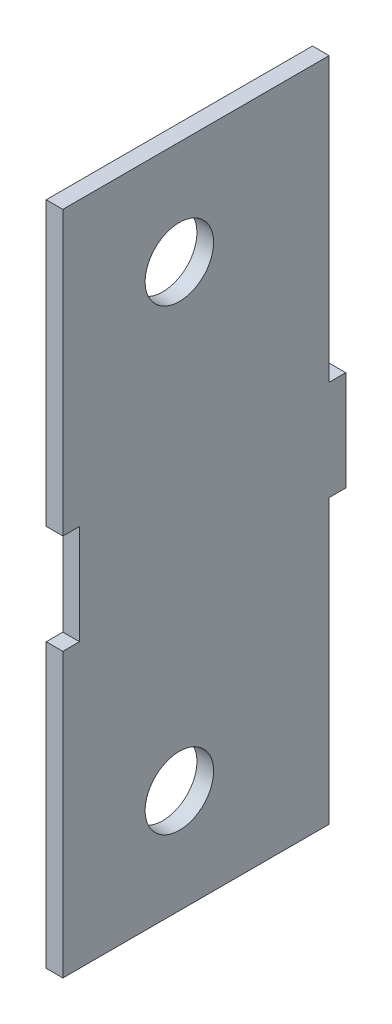
ISO-10303-21;
HEADER;
FILE_DESCRIPTION(('STEP AP214'),'2;1');
FILE_NAME('part.step','',(''),(''),'','','');
FILE_SCHEMA(('AUTOMOTIVE_DESIGN { 1 0 10303 214 1 1 1 1 }'));
ENDSEC;
DATA;
#1=APPLICATION_CONTEXT('core data for automotive mechanical design processes');
#2=APPLICATION_PROTOCOL_DEFINITION('international standard','automotive_design',2000,#1);
#3=PRODUCT_CONTEXT('',#1,'mechanical');
#4=PRODUCT('Part','Part','',(#3));
#5=PRODUCT_RELATED_PRODUCT_CATEGORY('part','',(#4));
#6=PRODUCT_DEFINITION_FORMATION('','',#4);
#7=PRODUCT_DEFINITION_CONTEXT('part definition',#1,'design');
#8=PRODUCT_DEFINITION('design','',#6,#7);
#9=PRODUCT_DEFINITION_SHAPE('','',#8);
#10=(LENGTH_UNIT() NAMED_UNIT(*) SI_UNIT(.MILLI.,.METRE.));
#11=(NAMED_UNIT(*) PLANE_ANGLE_UNIT() SI_UNIT($,.RADIAN.));
#12=(NAMED_UNIT(*) SI_UNIT($,.STERADIAN.) SOLID_ANGLE_UNIT());
#13=UNCERTAINTY_MEASURE_WITH_UNIT(LENGTH_MEASURE(1.E-05),#10,'distance_accuracy_value','');
#14=(GEOMETRIC_REPRESENTATION_CONTEXT(3) GLOBAL_UNCERTAINTY_ASSIGNED_CONTEXT((#13)) GLOBAL_UNIT_ASSIGNED_CONTEXT((#10,
#11,#12)) REPRESENTATION_CONTEXT('',''));
#15=CARTESIAN_POINT('',(0.,0.,0.));
#16=DIRECTION('',(0.,0.,1.));
#17=DIRECTION('',(1.,0.,0.));
#18=AXIS2_PLACEMENT_3D('',#15,#16,#17);
#19=CARTESIAN_POINT('',(1.5875,0.,0.));
#20=DIRECTION('',(-1.,0.,0.));
#21=DIRECTION('',(0.,0.,1.));
#22=AXIS2_PLACEMENT_3D('',#19,#20,#21);
#23=PLANE('',#22);
#24=CARTESIAN_POINT('',(1.5875,-21.844,1.58750000000008));
#25=DIRECTION('',(1.,0.,0.));
#26=DIRECTION('',(0.,0.,-1.));
#27=AXIS2_PLACEMENT_3D('',#24,#25,#26);
#28=CIRCLE('',#27,3.2639);
#29=CARTESIAN_POINT('',(1.5875,-21.844,-1.67639999999992));
#30=VERTEX_POINT('',#29);
#31=EDGE_CURVE('E181',#30,#30,#28,.T.);
#32=ORIENTED_EDGE('',*,*,#31,.F.);
#33=EDGE_LOOP('',(#32));
#34=FACE_BOUND('',#33,.T.);
#35=CARTESIAN_POINT('',(1.5875,21.844,1.58749999999993));
#36=DIRECTION('',(1.,0.,0.));
#37=DIRECTION('',(0.,0.,-1.));
#38=AXIS2_PLACEMENT_3D('',#35,#36,#37);
#39=CIRCLE('',#38,3.2639);
#40=CARTESIAN_POINT('',(1.5875,21.844,-1.67640000000007));
#41=VERTEX_POINT('',#40);
#42=EDGE_CURVE('E187',#41,#41,#39,.T.);
#43=ORIENTED_EDGE('',*,*,#42,.F.);
#44=EDGE_LOOP('',(#43));
#45=FACE_BOUND('',#44,.T.);
#46=DIRECTION('',(0.,0.,-1.));
#47=VECTOR('',#46,1.);
#48=CARTESIAN_POINT('',(1.5875,4.7625,12.7));
#49=LINE('',#48,#47);
#50=CARTESIAN_POINT('',(1.5875,4.7625,12.7));
#51=VERTEX_POINT('',#50);
#52=CARTESIAN_POINT('',(1.5875,4.7625,11.1125));
#53=VERTEX_POINT('',#52);
#54=EDGE_CURVE('E134',#51,#53,#49,.T.);
#55=ORIENTED_EDGE('',*,*,#54,.T.);
#56=DIRECTION('',(0.,-1.,0.));
#57=VECTOR('',#56,1.);
#58=CARTESIAN_POINT('',(1.5875,4.7625,11.1125));
#59=LINE('',#58,#57);
#60=CARTESIAN_POINT('',(1.5875,-4.7625,11.1125));
#61=VERTEX_POINT('',#60);
#62=EDGE_CURVE('E142',#53,#61,#59,.T.);
#63=ORIENTED_EDGE('',*,*,#62,.T.);
#64=DIRECTION('',(0.,0.,-1.));
#65=VECTOR('',#64,1.);
#66=CARTESIAN_POINT('',(1.5875,-4.7625,12.7));
#67=LINE('',#66,#65);
#68=CARTESIAN_POINT('',(1.5875,-4.7625,12.7));
#69=VERTEX_POINT('',#68);
#70=EDGE_CURVE('E147',#69,#61,#67,.T.);
#71=ORIENTED_EDGE('',*,*,#70,.F.);
#72=DIRECTION('',(0.,-1.,0.));
#73=VECTOR('',#72,1.);
#74=CARTESIAN_POINT('',(1.5875,-31.75,12.7));
#75=LINE('',#74,#73);
#76=CARTESIAN_POINT('',(1.5875,-31.75,12.7));
#77=VERTEX_POINT('',#76);
#78=EDGE_CURVE('E199',#69,#77,#75,.T.);
#79=ORIENTED_EDGE('',*,*,#78,.T.);
#80=DIRECTION('',(0.,0.,-1.));
#81=VECTOR('',#80,1.);
#82=CARTESIAN_POINT('',(1.5875,-31.75,12.7));
#83=LINE('',#82,#81);
#84=CARTESIAN_POINT('',(1.5875,-31.75,-12.7));
#85=VERTEX_POINT('',#84);
#86=EDGE_CURVE('E201',#77,#85,#83,.T.);
#87=ORIENTED_EDGE('',*,*,#86,.T.);
#88=DIRECTION('',(0.,1.,0.));
#89=VECTOR('',#88,1.);
#90=CARTESIAN_POINT('',(1.5875,-31.75,-12.7));
#91=LINE('',#90,#89);
#92=CARTESIAN_POINT('',(1.5875,-4.7625,-12.7));
#93=VERTEX_POINT('',#92);
#94=EDGE_CURVE('E193',#85,#93,#91,.T.);
#95=ORIENTED_EDGE('',*,*,#94,.T.);
#96=DIRECTION('',(0.,0.,-1.));
#97=VECTOR('',#96,1.);
#98=CARTESIAN_POINT('',(1.5875,-4.7625,-12.7));
#99=LINE('',#98,#97);
#100=CARTESIAN_POINT('',(1.5875,-4.7625,-14.2875));
#101=VERTEX_POINT('',#100);
#102=EDGE_CURVE('E64',#93,#101,#99,.T.);
#103=ORIENTED_EDGE('',*,*,#102,.T.);
#104=DIRECTION('',(0.,-1.,0.));
#105=VECTOR('',#104,1.);
#106=CARTESIAN_POINT('',(1.5875,4.7625,-14.2875));
#107=LINE('',#106,#105);
#108=CARTESIAN_POINT('',(1.5875,4.7625,-14.2875));
#109=VERTEX_POINT('',#108);
#110=EDGE_CURVE('E168',#109,#101,#107,.T.);
#111=ORIENTED_EDGE('',*,*,#110,.F.);
#112=DIRECTION('',(0.,0.,-1.));
#113=VECTOR('',#112,1.);
#114=CARTESIAN_POINT('',(1.5875,4.7625,-12.7));
#115=LINE('',#114,#113);
#116=CARTESIAN_POINT('',(1.5875,4.7625,-12.7));
#117=VERTEX_POINT('',#116);
#118=EDGE_CURVE('E162',#117,#109,#115,.T.);
#119=ORIENTED_EDGE('',*,*,#118,.F.);
#120=CARTESIAN_POINT('',(1.5875,31.75,-12.7));
#121=VERTEX_POINT('',#120);
#122=EDGE_CURVE('E197',#117,#121,#91,.T.);
#123=ORIENTED_EDGE('',*,*,#122,.T.);
#124=DIRECTION('',(0.,0.,1.));
#125=VECTOR('',#124,1.);
#126=CARTESIAN_POINT('',(1.5875,31.75,12.7));
#127=LINE('',#126,#125);
#128=CARTESIAN_POINT('',(1.5875,31.75,12.7));
#129=VERTEX_POINT('',#128);
#130=EDGE_CURVE('E196',#121,#129,#127,.T.);
#131=ORIENTED_EDGE('',*,*,#130,.T.);
#132=EDGE_CURVE('E151',#129,#51,#75,.T.);
#133=ORIENTED_EDGE('',*,*,#132,.T.);
#134=EDGE_LOOP('',(#55,#63,#71,#79,#87,#95,#103,#111,#119,#123,#131,#133));
#135=FACE_BOUND('',#134,.T.);
#136=ADVANCED_FACE('F41',(#34,#45,#135),#23,.F.);
#137=CARTESIAN_POINT('',(0.,0.,0.));
#138=DIRECTION('',(-1.,0.,0.));
#139=DIRECTION('',(0.,0.,1.));
#140=AXIS2_PLACEMENT_3D('',#137,#138,#139);
#141=PLANE('',#140);
#142=CARTESIAN_POINT('',(0.,21.844,1.58749999999993));
#143=DIRECTION('',(1.,0.,0.));
#144=DIRECTION('',(0.,0.,-1.));
#145=AXIS2_PLACEMENT_3D('',#142,#143,#144);
#146=CIRCLE('',#145,3.2639);
#147=CARTESIAN_POINT('',(0.,21.844,-1.67640000000007));
#148=VERTEX_POINT('',#147);
#149=EDGE_CURVE('E184',#148,#148,#146,.T.);
#150=ORIENTED_EDGE('',*,*,#149,.T.);
#151=EDGE_LOOP('',(#150));
#152=FACE_BOUND('',#151,.T.);
#153=CARTESIAN_POINT('',(0.,-21.844,1.58750000000008));
#154=DIRECTION('',(1.,0.,0.));
#155=DIRECTION('',(0.,0.,-1.));
#156=AXIS2_PLACEMENT_3D('',#153,#154,#155);
#157=CIRCLE('',#156,3.2639);
#158=CARTESIAN_POINT('',(0.,-21.844,-1.67639999999992));
#159=VERTEX_POINT('',#158);
#160=EDGE_CURVE('E174',#159,#159,#157,.T.);
#161=ORIENTED_EDGE('',*,*,#160,.T.);
#162=EDGE_LOOP('',(#161));
#163=FACE_BOUND('',#162,.T.);
#164=DIRECTION('',(0.,1.,0.));
#165=VECTOR('',#164,1.);
#166=CARTESIAN_POINT('',(0.,0.,11.1125));
#167=LINE('',#166,#165);
#168=CARTESIAN_POINT('',(0.,-4.7625,11.1125));
#169=VERTEX_POINT('',#168);
#170=CARTESIAN_POINT('',(0.,4.7625,11.1125));
#171=VERTEX_POINT('',#170);
#172=EDGE_CURVE('E11',#169,#171,#167,.T.);
#173=ORIENTED_EDGE('',*,*,#172,.T.);
#174=DIRECTION('',(0.,0.,1.));
#175=VECTOR('',#174,1.);
#176=CARTESIAN_POINT('',(0.,4.7625,0.));
#177=LINE('',#176,#175);
#178=CARTESIAN_POINT('',(0.,4.7625,12.7));
#179=VERTEX_POINT('',#178);
#180=EDGE_CURVE('E137',#171,#179,#177,.T.);
#181=ORIENTED_EDGE('',*,*,#180,.T.);
#182=DIRECTION('',(0.,-1.,0.));
#183=VECTOR('',#182,1.);
#184=CARTESIAN_POINT('',(0.,-31.75,12.7));
#185=LINE('',#184,#183);
#186=CARTESIAN_POINT('',(0.,31.75,12.7));
#187=VERTEX_POINT('',#186);
#188=EDGE_CURVE('E210',#187,#179,#185,.T.);
#189=ORIENTED_EDGE('',*,*,#188,.F.);
#190=DIRECTION('',(0.,0.,1.));
#191=VECTOR('',#190,1.);
#192=CARTESIAN_POINT('',(0.,31.75,12.7));
#193=LINE('',#192,#191);
#194=CARTESIAN_POINT('',(0.,31.75,-12.7));
#195=VERTEX_POINT('',#194);
#196=EDGE_CURVE('E207',#195,#187,#193,.T.);
#197=ORIENTED_EDGE('',*,*,#196,.F.);
#198=DIRECTION('',(0.,1.,0.));
#199=VECTOR('',#198,1.);
#200=CARTESIAN_POINT('',(0.,-31.75,-12.7));
#201=LINE('',#200,#199);
#202=CARTESIAN_POINT('',(0.,4.7625,-12.7));
#203=VERTEX_POINT('',#202);
#204=EDGE_CURVE('E190',#203,#195,#201,.T.);
#205=ORIENTED_EDGE('',*,*,#204,.F.);
#206=DIRECTION('',(0.,0.,-1.));
#207=VECTOR('',#206,1.);
#208=CARTESIAN_POINT('',(0.,4.7625,-12.7));
#209=LINE('',#208,#207);
#210=CARTESIAN_POINT('',(0.,4.7625,-14.2875));
#211=VERTEX_POINT('',#210);
#212=EDGE_CURVE('E164',#203,#211,#209,.T.);
#213=ORIENTED_EDGE('',*,*,#212,.T.);
#214=DIRECTION('',(0.,-1.,0.));
#215=VECTOR('',#214,1.);
#216=CARTESIAN_POINT('',(0.,4.7625,-14.2875));
#217=LINE('',#216,#215);
#218=CARTESIAN_POINT('',(0.,-4.7625,-14.2875));
#219=VERTEX_POINT('',#218);
#220=EDGE_CURVE('E161',#211,#219,#217,.T.);
#221=ORIENTED_EDGE('',*,*,#220,.T.);
#222=DIRECTION('',(0.,0.,-1.));
#223=VECTOR('',#222,1.);
#224=CARTESIAN_POINT('',(0.,-4.7625,-12.7));
#225=LINE('',#224,#223);
#226=CARTESIAN_POINT('',(0.,-4.7625,-12.7));
#227=VERTEX_POINT('',#226);
#228=EDGE_CURVE('E158',#227,#219,#225,.T.);
#229=ORIENTED_EDGE('',*,*,#228,.F.);
#230=CARTESIAN_POINT('',(0.,-31.75,-12.7));
#231=VERTEX_POINT('',#230);
#232=EDGE_CURVE('E204',#231,#227,#201,.T.);
#233=ORIENTED_EDGE('',*,*,#232,.F.);
#234=DIRECTION('',(0.,0.,-1.));
#235=VECTOR('',#234,1.);
#236=CARTESIAN_POINT('',(0.,-31.75,12.7));
#237=LINE('',#236,#235);
#238=CARTESIAN_POINT('',(0.,-31.75,12.7));
#239=VERTEX_POINT('',#238);
#240=EDGE_CURVE('E213',#239,#231,#237,.T.);
#241=ORIENTED_EDGE('',*,*,#240,.F.);
#242=CARTESIAN_POINT('',(0.,-4.7625,12.7));
#243=VERTEX_POINT('',#242);
#244=EDGE_CURVE('E209',#243,#239,#185,.T.);
#245=ORIENTED_EDGE('',*,*,#244,.F.);
#246=DIRECTION('',(0.,0.,1.));
#247=VECTOR('',#246,1.);
#248=CARTESIAN_POINT('',(0.,-4.76249999999999,0.));
#249=LINE('',#248,#247);
#250=EDGE_CURVE('E56',#169,#243,#249,.T.);
#251=ORIENTED_EDGE('',*,*,#250,.F.);
#252=EDGE_LOOP('',(#173,#181,#189,#197,#205,#213,#221,#229,#233,#241,#245,#251));
#253=FACE_BOUND('',#252,.T.);
#254=ADVANCED_FACE('F230',(#152,#163,#253),#141,.T.);
#255=CARTESIAN_POINT('',(1.5875,-31.75,12.7));
#256=DIRECTION('',(0.,0.,-1.));
#257=DIRECTION('',(-1.,0.,0.));
#258=AXIS2_PLACEMENT_3D('',#255,#256,#257);
#259=PLANE('',#258);
#260=DIRECTION('',(-1.,0.,0.));
#261=VECTOR('',#260,1.);
#262=CARTESIAN_POINT('',(1.5875,4.7625,12.7));
#263=LINE('',#262,#261);
#264=EDGE_CURVE('E49',#51,#179,#263,.T.);
#265=ORIENTED_EDGE('',*,*,#264,.F.);
#266=ORIENTED_EDGE('',*,*,#132,.F.);
#267=DIRECTION('',(-1.,0.,0.));
#268=VECTOR('',#267,1.);
#269=CARTESIAN_POINT('',(1.5875,31.75,12.7));
#270=LINE('',#269,#268);
#271=EDGE_CURVE('E220',#129,#187,#270,.T.);
#272=ORIENTED_EDGE('',*,*,#271,.T.);
#273=ORIENTED_EDGE('',*,*,#188,.T.);
#274=EDGE_LOOP('',(#265,#266,#272,#273));
#275=FACE_BOUND('',#274,.T.);
#276=ADVANCED_FACE('F232',(#275),#259,.F.);
#277=CARTESIAN_POINT('',(1.5875,-31.75,-12.7));
#278=DIRECTION('',(0.,0.,1.));
#279=DIRECTION('',(1.,0.,0.));
#280=AXIS2_PLACEMENT_3D('',#277,#278,#279);
#281=PLANE('',#280);
#282=DIRECTION('',(1.,0.,0.));
#283=VECTOR('',#282,1.);
#284=CARTESIAN_POINT('',(0.,4.7625,-12.7));
#285=LINE('',#284,#283);
#286=EDGE_CURVE('E175',#203,#117,#285,.T.);
#287=ORIENTED_EDGE('',*,*,#286,.F.);
#288=ORIENTED_EDGE('',*,*,#204,.T.);
#289=DIRECTION('',(-1.,0.,0.));
#290=VECTOR('',#289,1.);
#291=CARTESIAN_POINT('',(1.5875,31.75,-12.7));
#292=LINE('',#291,#290);
#293=EDGE_CURVE('E223',#121,#195,#292,.T.);
#294=ORIENTED_EDGE('',*,*,#293,.F.);
#295=ORIENTED_EDGE('',*,*,#122,.F.);
#296=EDGE_LOOP('',(#287,#288,#294,#295));
#297=FACE_BOUND('',#296,.T.);
#298=ADVANCED_FACE('F242',(#297),#281,.F.);
#299=ORIENTED_EDGE('',*,*,#232,.T.);
#300=DIRECTION('',(1.,0.,0.));
#301=VECTOR('',#300,1.);
#302=CARTESIAN_POINT('',(0.,-4.7625,-12.7));
#303=LINE('',#302,#301);
#304=EDGE_CURVE('E172',#227,#93,#303,.T.);
#305=ORIENTED_EDGE('',*,*,#304,.T.);
#306=ORIENTED_EDGE('',*,*,#94,.F.);
#307=DIRECTION('',(-1.,0.,0.));
#308=VECTOR('',#307,1.);
#309=CARTESIAN_POINT('',(1.5875,-31.75,-12.7));
#310=LINE('',#309,#308);
#311=EDGE_CURVE('E203',#85,#231,#310,.T.);
#312=ORIENTED_EDGE('',*,*,#311,.T.);
#313=EDGE_LOOP('',(#299,#305,#306,#312));
#314=FACE_BOUND('',#313,.T.);
#315=ADVANCED_FACE('F43',(#314),#281,.F.);
#316=CARTESIAN_POINT('',(1.5875,31.75,12.7));
#317=DIRECTION('',(0.,-1.,0.));
#318=DIRECTION('',(0.,0.,-1.));
#319=AXIS2_PLACEMENT_3D('',#316,#317,#318);
#320=PLANE('',#319);
#321=ORIENTED_EDGE('',*,*,#196,.T.);
#322=ORIENTED_EDGE('',*,*,#271,.F.);
#323=ORIENTED_EDGE('',*,*,#130,.F.);
#324=ORIENTED_EDGE('',*,*,#293,.T.);
#325=EDGE_LOOP('',(#321,#322,#323,#324));
#326=FACE_BOUND('',#325,.T.);
#327=ADVANCED_FACE('F236',(#326),#320,.F.);
#328=ORIENTED_EDGE('',*,*,#78,.F.);
#329=DIRECTION('',(-1.,0.,0.));
#330=VECTOR('',#329,1.);
#331=CARTESIAN_POINT('',(1.5875,-4.7625,12.7));
#332=LINE('',#331,#330);
#333=EDGE_CURVE('E226',#69,#243,#332,.T.);
#334=ORIENTED_EDGE('',*,*,#333,.T.);
#335=ORIENTED_EDGE('',*,*,#244,.T.);
#336=DIRECTION('',(-1.,0.,0.));
#337=VECTOR('',#336,1.);
#338=CARTESIAN_POINT('',(1.5875,-31.75,12.7));
#339=LINE('',#338,#337);
#340=EDGE_CURVE('E217',#77,#239,#339,.T.);
#341=ORIENTED_EDGE('',*,*,#340,.F.);
#342=EDGE_LOOP('',(#328,#334,#335,#341));
#343=FACE_BOUND('',#342,.T.);
#344=ADVANCED_FACE('F265',(#343),#259,.F.);
#345=CARTESIAN_POINT('',(1.5875,-31.75,12.7));
#346=DIRECTION('',(0.,1.,0.));
#347=DIRECTION('',(0.,0.,1.));
#348=AXIS2_PLACEMENT_3D('',#345,#346,#347);
#349=PLANE('',#348);
#350=ORIENTED_EDGE('',*,*,#240,.T.);
#351=ORIENTED_EDGE('',*,*,#311,.F.);
#352=ORIENTED_EDGE('',*,*,#86,.F.);
#353=ORIENTED_EDGE('',*,*,#340,.T.);
#354=EDGE_LOOP('',(#350,#351,#352,#353));
#355=FACE_BOUND('',#354,.T.);
#356=ADVANCED_FACE('F260',(#355),#349,.F.);
#357=CARTESIAN_POINT('',(1.5875,21.844,1.58749999999993));
#358=DIRECTION('',(-1.,0.,0.));
#359=DIRECTION('',(0.,0.,1.));
#360=AXIS2_PLACEMENT_3D('',#357,#358,#359);
#361=CYLINDRICAL_SURFACE('',#360,3.2639);
#362=ORIENTED_EDGE('',*,*,#42,.T.);
#363=EDGE_LOOP('',(#362));
#364=FACE_BOUND('',#363,.T.);
#365=ORIENTED_EDGE('',*,*,#149,.F.);
#366=EDGE_LOOP('',(#365));
#367=FACE_BOUND('',#366,.T.);
#368=ADVANCED_FACE('F285',(#364,#367),#361,.F.);
#369=CARTESIAN_POINT('',(1.5875,-21.844,1.58750000000008));
#370=DIRECTION('',(-1.,0.,0.));
#371=DIRECTION('',(0.,0.,1.));
#372=AXIS2_PLACEMENT_3D('',#369,#370,#371);
#373=CYLINDRICAL_SURFACE('',#372,3.2639);
#374=ORIENTED_EDGE('',*,*,#31,.T.);
#375=EDGE_LOOP('',(#374));
#376=FACE_BOUND('',#375,.T.);
#377=ORIENTED_EDGE('',*,*,#160,.F.);
#378=EDGE_LOOP('',(#377));
#379=FACE_BOUND('',#378,.T.);
#380=ADVANCED_FACE('F363',(#376,#379),#373,.F.);
#381=CARTESIAN_POINT('',(0.,-4.7625,-12.7));
#382=DIRECTION('',(0.,-1.,0.));
#383=DIRECTION('',(0.,0.,-1.));
#384=AXIS2_PLACEMENT_3D('',#381,#382,#383);
#385=PLANE('',#384);
#386=ORIENTED_EDGE('',*,*,#102,.F.);
#387=ORIENTED_EDGE('',*,*,#304,.F.);
#388=ORIENTED_EDGE('',*,*,#228,.T.);
#389=DIRECTION('',(1.,0.,0.));
#390=VECTOR('',#389,1.);
#391=CARTESIAN_POINT('',(0.,-4.7625,-14.2875));
#392=LINE('',#391,#390);
#393=EDGE_CURVE('E166',#219,#101,#392,.T.);
#394=ORIENTED_EDGE('',*,*,#393,.T.);
#395=EDGE_LOOP('',(#386,#387,#388,#394));
#396=FACE_BOUND('',#395,.T.);
#397=ADVANCED_FACE('F356',(#396),#385,.T.);
#398=CARTESIAN_POINT('',(0.,4.7625,-12.7));
#399=DIRECTION('',(0.,-1.,0.));
#400=DIRECTION('',(0.,0.,-1.));
#401=AXIS2_PLACEMENT_3D('',#398,#399,#400);
#402=PLANE('',#401);
#403=ORIENTED_EDGE('',*,*,#118,.T.);
#404=DIRECTION('',(1.,0.,0.));
#405=VECTOR('',#404,1.);
#406=CARTESIAN_POINT('',(0.,4.7625,-14.2875));
#407=LINE('',#406,#405);
#408=EDGE_CURVE('E177',#211,#109,#407,.T.);
#409=ORIENTED_EDGE('',*,*,#408,.F.);
#410=ORIENTED_EDGE('',*,*,#212,.F.);
#411=ORIENTED_EDGE('',*,*,#286,.T.);
#412=EDGE_LOOP('',(#403,#409,#410,#411));
#413=FACE_BOUND('',#412,.T.);
#414=ADVANCED_FACE('F246',(#413),#402,.F.);
#415=CARTESIAN_POINT('',(0.,4.7625,-14.2875));
#416=DIRECTION('',(0.,0.,1.));
#417=DIRECTION('',(1.,0.,0.));
#418=AXIS2_PLACEMENT_3D('',#415,#416,#417);
#419=PLANE('',#418);
#420=ORIENTED_EDGE('',*,*,#110,.T.);
#421=ORIENTED_EDGE('',*,*,#393,.F.);
#422=ORIENTED_EDGE('',*,*,#220,.F.);
#423=ORIENTED_EDGE('',*,*,#408,.T.);
#424=EDGE_LOOP('',(#420,#421,#422,#423));
#425=FACE_BOUND('',#424,.T.);
#426=ADVANCED_FACE('F250',(#425),#419,.F.);
#427=CARTESIAN_POINT('',(-1.5875,4.7625,12.7));
#428=DIRECTION('',(0.,-1.,0.));
#429=DIRECTION('',(0.,0.,-1.));
#430=AXIS2_PLACEMENT_3D('',#427,#428,#429);
#431=PLANE('',#430);
#432=DIRECTION('',(1.,0.,0.));
#433=VECTOR('',#432,1.);
#434=CARTESIAN_POINT('',(-1.5875,4.7625,11.1125));
#435=LINE('',#434,#433);
#436=EDGE_CURVE('E130',#171,#53,#435,.T.);
#437=ORIENTED_EDGE('',*,*,#436,.T.);
#438=ORIENTED_EDGE('',*,*,#54,.F.);
#439=ORIENTED_EDGE('',*,*,#264,.T.);
#440=ORIENTED_EDGE('',*,*,#180,.F.);
#441=EDGE_LOOP('',(#437,#438,#439,#440));
#442=FACE_BOUND('',#441,.T.);
#443=ADVANCED_FACE('F132',(#442),#431,.T.);
#444=CARTESIAN_POINT('',(-1.5875,4.7625,11.1125));
#445=DIRECTION('',(0.,0.,1.));
#446=DIRECTION('',(1.,0.,0.));
#447=AXIS2_PLACEMENT_3D('',#444,#445,#446);
#448=PLANE('',#447);
#449=DIRECTION('',(1.,0.,0.));
#450=VECTOR('',#449,1.);
#451=CARTESIAN_POINT('',(-1.5875,-4.7625,11.1125));
#452=LINE('',#451,#450);
#453=EDGE_CURVE('E139',#169,#61,#452,.T.);
#454=ORIENTED_EDGE('',*,*,#453,.T.);
#455=ORIENTED_EDGE('',*,*,#62,.F.);
#456=ORIENTED_EDGE('',*,*,#436,.F.);
#457=ORIENTED_EDGE('',*,*,#172,.F.);
#458=EDGE_LOOP('',(#454,#455,#456,#457));
#459=FACE_BOUND('',#458,.T.);
#460=ADVANCED_FACE('F143',(#459),#448,.T.);
#461=CARTESIAN_POINT('',(-1.5875,-4.7625,12.7));
#462=DIRECTION('',(0.,-1.,0.));
#463=DIRECTION('',(0.,0.,-1.));
#464=AXIS2_PLACEMENT_3D('',#461,#462,#463);
#465=PLANE('',#464);
#466=ORIENTED_EDGE('',*,*,#250,.T.);
#467=ORIENTED_EDGE('',*,*,#333,.F.);
#468=ORIENTED_EDGE('',*,*,#70,.T.);
#469=ORIENTED_EDGE('',*,*,#453,.F.);
#470=EDGE_LOOP('',(#466,#467,#468,#469));
#471=FACE_BOUND('',#470,.T.);
#472=ADVANCED_FACE('F266',(#471),#465,.F.);
#473=CLOSED_SHELL('',(#136,#254,#276,#298,#315,#327,#344,#356,#368,#380,#397,#414,#426,#443,
#460,#472));
#474=MANIFOLD_SOLID_BREP('B2',#473);
#475=ADVANCED_BREP_SHAPE_REPRESENTATION('',(#18,#474),#14);
#476=SHAPE_DEFINITION_REPRESENTATION(#9,#475);
ENDSEC;
END-ISO-10303-21;
